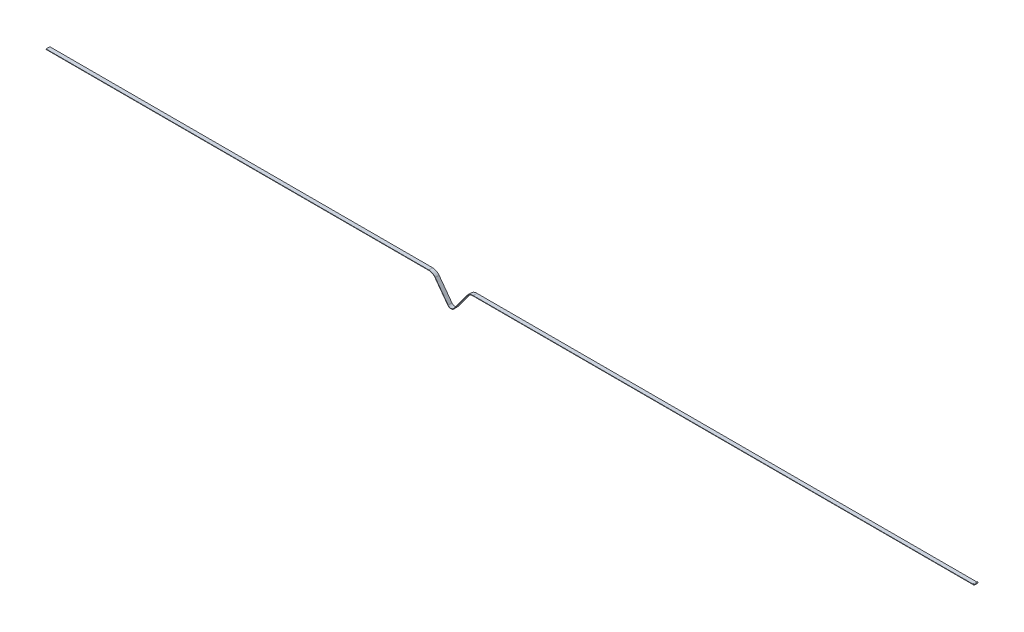
ISO-10303-21;
HEADER;
FILE_DESCRIPTION(('STEP AP214'),'2;1');
FILE_NAME('part.step','',(''),(''),'','','');
FILE_SCHEMA(('AUTOMOTIVE_DESIGN { 1 0 10303 214 1 1 1 1 }'));
ENDSEC;
DATA;
#1=APPLICATION_CONTEXT('core data for automotive mechanical design processes');
#2=APPLICATION_PROTOCOL_DEFINITION('international standard','automotive_design',2000,#1);
#3=PRODUCT_CONTEXT('',#1,'mechanical');
#4=PRODUCT('Part','Part','',(#3));
#5=PRODUCT_RELATED_PRODUCT_CATEGORY('part','',(#4));
#6=PRODUCT_DEFINITION_FORMATION('','',#4);
#7=PRODUCT_DEFINITION_CONTEXT('part definition',#1,'design');
#8=PRODUCT_DEFINITION('design','',#6,#7);
#9=PRODUCT_DEFINITION_SHAPE('','',#8);
#10=(LENGTH_UNIT() NAMED_UNIT(*) SI_UNIT(.MILLI.,.METRE.));
#11=(NAMED_UNIT(*) PLANE_ANGLE_UNIT() SI_UNIT($,.RADIAN.));
#12=(NAMED_UNIT(*) SI_UNIT($,.STERADIAN.) SOLID_ANGLE_UNIT());
#13=UNCERTAINTY_MEASURE_WITH_UNIT(LENGTH_MEASURE(1.E-05),#10,'distance_accuracy_value','');
#14=(GEOMETRIC_REPRESENTATION_CONTEXT(3) GLOBAL_UNCERTAINTY_ASSIGNED_CONTEXT((#13)) GLOBAL_UNIT_ASSIGNED_CONTEXT((#10,
#11,#12)) REPRESENTATION_CONTEXT('',''));
#15=CARTESIAN_POINT('',(0.,0.,0.));
#16=DIRECTION('',(0.,0.,1.));
#17=DIRECTION('',(1.,0.,0.));
#18=AXIS2_PLACEMENT_3D('',#15,#16,#17);
#19=CARTESIAN_POINT('',(0.,0.,0.));
#20=DIRECTION('',(-1.,0.,0.));
#21=DIRECTION('',(0.,0.,1.));
#22=AXIS2_PLACEMENT_3D('',#19,#20,#21);
#23=PLANE('',#22);
#24=DIRECTION('',(0.,-1.,0.));
#25=VECTOR('',#24,1.);
#26=CARTESIAN_POINT('',(0.,0.,0.));
#27=LINE('',#26,#25);
#28=CARTESIAN_POINT('',(0.,0.63,0.));
#29=VERTEX_POINT('',#28);
#30=CARTESIAN_POINT('',(0.,0.,0.));
#31=VERTEX_POINT('',#30);
#32=EDGE_CURVE('E247',#29,#31,#27,.T.);
#33=ORIENTED_EDGE('',*,*,#32,.T.);
#34=DIRECTION('',(0.,0.,-1.));
#35=VECTOR('',#34,1.);
#36=CARTESIAN_POINT('',(0.,0.,0.));
#37=LINE('',#36,#35);
#38=CARTESIAN_POINT('',(0.,0.,-6.));
#39=VERTEX_POINT('',#38);
#40=EDGE_CURVE('E181',#31,#39,#37,.T.);
#41=ORIENTED_EDGE('',*,*,#40,.T.);
#42=DIRECTION('',(0.,1.,0.));
#43=VECTOR('',#42,1.);
#44=CARTESIAN_POINT('',(0.,0.,-6.));
#45=LINE('',#44,#43);
#46=CARTESIAN_POINT('',(0.,0.63,-6.));
#47=VERTEX_POINT('',#46);
#48=EDGE_CURVE('E167',#39,#47,#45,.T.);
#49=ORIENTED_EDGE('',*,*,#48,.T.);
#50=DIRECTION('',(0.,0.,1.));
#51=VECTOR('',#50,1.);
#52=CARTESIAN_POINT('',(0.,0.63,0.));
#53=LINE('',#52,#51);
#54=EDGE_CURVE('E156',#47,#29,#53,.T.);
#55=ORIENTED_EDGE('',*,*,#54,.T.);
#56=EDGE_LOOP('',(#33,#41,#49,#55));
#57=FACE_BOUND('',#56,.T.);
#58=ADVANCED_FACE('F33',(#57),#23,.F.);
#59=CARTESIAN_POINT('',(-1447.8,0.,0.));
#60=DIRECTION('',(-1.,0.,0.));
#61=DIRECTION('',(0.,0.,1.));
#62=AXIS2_PLACEMENT_3D('',#59,#60,#61);
#63=PLANE('',#62);
#64=DIRECTION('',(0.,-1.,0.));
#65=VECTOR('',#64,1.);
#66=CARTESIAN_POINT('',(-1447.8,0.,0.));
#67=LINE('',#66,#65);
#68=CARTESIAN_POINT('',(-1447.8,0.629999999999915,0.));
#69=VERTEX_POINT('',#68);
#70=CARTESIAN_POINT('',(-1447.8,0.,0.));
#71=VERTEX_POINT('',#70);
#72=EDGE_CURVE('E55',#69,#71,#67,.T.);
#73=ORIENTED_EDGE('',*,*,#72,.F.);
#74=DIRECTION('',(0.,0.,1.));
#75=VECTOR('',#74,1.);
#76=CARTESIAN_POINT('',(-1447.8,0.629999999999915,0.));
#77=LINE('',#76,#75);
#78=CARTESIAN_POINT('',(-1447.8,0.629999999999915,-6.));
#79=VERTEX_POINT('',#78);
#80=EDGE_CURVE('E243',#79,#69,#77,.T.);
#81=ORIENTED_EDGE('',*,*,#80,.F.);
#82=DIRECTION('',(0.,1.,0.));
#83=VECTOR('',#82,1.);
#84=CARTESIAN_POINT('',(-1447.8,0.,-6.));
#85=LINE('',#84,#83);
#86=CARTESIAN_POINT('',(-1447.8,0.,-6.));
#87=VERTEX_POINT('',#86);
#88=EDGE_CURVE('E237',#87,#79,#85,.T.);
#89=ORIENTED_EDGE('',*,*,#88,.F.);
#90=DIRECTION('',(0.,0.,-1.));
#91=VECTOR('',#90,1.);
#92=CARTESIAN_POINT('',(-1447.8,0.,0.));
#93=LINE('',#92,#91);
#94=EDGE_CURVE('E11',#71,#87,#93,.T.);
#95=ORIENTED_EDGE('',*,*,#94,.F.);
#96=EDGE_LOOP('',(#73,#81,#89,#95));
#97=FACE_BOUND('',#96,.T.);
#98=ADVANCED_FACE('F367',(#97),#63,.T.);
#99=CARTESIAN_POINT('',(0.,0.,-6.));
#100=DIRECTION('',(0.,0.,1.));
#101=DIRECTION('',(1.,0.,0.));
#102=AXIS2_PLACEMENT_3D('',#99,#100,#101);
#103=PLANE('',#102);
#104=DIRECTION('',(-1.,0.,0.));
#105=VECTOR('',#104,1.);
#106=CARTESIAN_POINT('',(0.,0.63,-6.));
#107=LINE('',#106,#105);
#108=CARTESIAN_POINT('',(-1.5,0.63,-6.));
#109=VERTEX_POINT('',#108);
#110=CARTESIAN_POINT('',(-781.58134885008,0.629999999999905,-6.));
#111=VERTEX_POINT('',#110);
#112=EDGE_CURVE('E164',#109,#111,#107,.T.);
#113=ORIENTED_EDGE('',*,*,#112,.F.);
#114=CARTESIAN_POINT('',(-0.75,0.63,-6.));
#115=DIRECTION('',(0.,0.,1.));
#116=DIRECTION('',(1.,0.,0.));
#117=AXIS2_PLACEMENT_3D('',#114,#115,#116);
#118=CIRCLE('',#117,0.75);
#119=EDGE_CURVE('E150',#47,#109,#118,.T.);
#120=ORIENTED_EDGE('',*,*,#119,.F.);
#121=ORIENTED_EDGE('',*,*,#48,.F.);
#122=DIRECTION('',(-1.,0.,0.));
#123=VECTOR('',#122,1.);
#124=CARTESIAN_POINT('',(0.,0.,-6.));
#125=LINE('',#124,#123);
#126=CARTESIAN_POINT('',(-781.58134885008,0.,-6.));
#127=VERTEX_POINT('',#126);
#128=EDGE_CURVE('E176',#39,#127,#125,.T.);
#129=ORIENTED_EDGE('',*,*,#128,.T.);
#130=DIRECTION('',(0.,1.,0.));
#131=VECTOR('',#130,1.);
#132=CARTESIAN_POINT('',(-781.58134885008,0.,-6.));
#133=LINE('',#132,#131);
#134=EDGE_CURVE('E172',#127,#111,#133,.T.);
#135=ORIENTED_EDGE('',*,*,#134,.T.);
#136=EDGE_LOOP('',(#113,#120,#121,#129,#135));
#137=FACE_BOUND('',#136,.T.);
#138=ADVANCED_FACE('F170',(#137),#103,.F.);
#139=CARTESIAN_POINT('',(0.,0.63,0.));
#140=DIRECTION('',(0.,-1.,0.));
#141=DIRECTION('',(1.,0.,0.));
#142=AXIS2_PLACEMENT_3D('',#139,#140,#141);
#143=PLANE('',#142);
#144=DIRECTION('',(-1.,0.,0.));
#145=VECTOR('',#144,1.);
#146=CARTESIAN_POINT('',(0.,0.63,0.));
#147=LINE('',#146,#145);
#148=CARTESIAN_POINT('',(-1.5,0.63,0.));
#149=VERTEX_POINT('',#148);
#150=CARTESIAN_POINT('',(-781.58134885008,0.629999999999905,0.));
#151=VERTEX_POINT('',#150);
#152=EDGE_CURVE('E166',#149,#151,#147,.T.);
#153=ORIENTED_EDGE('',*,*,#152,.F.);
#154=DIRECTION('',(0.,0.,1.));
#155=VECTOR('',#154,1.);
#156=CARTESIAN_POINT('',(-1.5,0.63,-6.));
#157=LINE('',#156,#155);
#158=EDGE_CURVE('E153',#109,#149,#157,.T.);
#159=ORIENTED_EDGE('',*,*,#158,.F.);
#160=ORIENTED_EDGE('',*,*,#112,.T.);
#161=DIRECTION('',(0.,0.,1.));
#162=VECTOR('',#161,1.);
#163=CARTESIAN_POINT('',(-781.58134885008,0.629999999999905,0.));
#164=LINE('',#163,#162);
#165=EDGE_CURVE('E173',#111,#151,#164,.T.);
#166=ORIENTED_EDGE('',*,*,#165,.T.);
#167=EDGE_LOOP('',(#153,#159,#160,#166));
#168=FACE_BOUND('',#167,.T.);
#169=ADVANCED_FACE('F162',(#168),#143,.F.);
#170=CARTESIAN_POINT('',(0.,0.,0.));
#171=DIRECTION('',(0.,0.,-1.));
#172=DIRECTION('',(-1.,0.,0.));
#173=AXIS2_PLACEMENT_3D('',#170,#171,#172);
#174=PLANE('',#173);
#175=DIRECTION('',(0.,-1.,0.));
#176=VECTOR('',#175,1.);
#177=CARTESIAN_POINT('',(-781.58134885008,0.,0.));
#178=LINE('',#177,#176);
#179=CARTESIAN_POINT('',(-781.58134885008,0.,0.));
#180=VERTEX_POINT('',#179);
#181=EDGE_CURVE('E250',#151,#180,#178,.T.);
#182=ORIENTED_EDGE('',*,*,#181,.T.);
#183=DIRECTION('',(-1.,0.,0.));
#184=VECTOR('',#183,1.);
#185=CARTESIAN_POINT('',(0.,0.,0.));
#186=LINE('',#185,#184);
#187=EDGE_CURVE('E288',#31,#180,#186,.T.);
#188=ORIENTED_EDGE('',*,*,#187,.F.);
#189=ORIENTED_EDGE('',*,*,#32,.F.);
#190=CARTESIAN_POINT('',(-0.75,0.63,0.));
#191=DIRECTION('',(0.,0.,1.));
#192=DIRECTION('',(1.,0.,0.));
#193=AXIS2_PLACEMENT_3D('',#190,#191,#192);
#194=CIRCLE('',#193,0.75);
#195=EDGE_CURVE('E47',#29,#149,#194,.T.);
#196=ORIENTED_EDGE('',*,*,#195,.T.);
#197=ORIENTED_EDGE('',*,*,#152,.T.);
#198=EDGE_LOOP('',(#182,#188,#189,#196,#197));
#199=FACE_BOUND('',#198,.T.);
#200=ADVANCED_FACE('F415',(#199),#174,.F.);
#201=CARTESIAN_POINT('',(0.,0.,0.));
#202=DIRECTION('',(0.,1.,0.));
#203=DIRECTION('',(-1.,0.,0.));
#204=AXIS2_PLACEMENT_3D('',#201,#202,#203);
#205=PLANE('',#204);
#206=DIRECTION('',(0.,0.,-1.));
#207=VECTOR('',#206,1.);
#208=CARTESIAN_POINT('',(-781.58134885008,0.,0.));
#209=LINE('',#208,#207);
#210=EDGE_CURVE('E192',#180,#127,#209,.T.);
#211=ORIENTED_EDGE('',*,*,#210,.T.);
#212=ORIENTED_EDGE('',*,*,#128,.F.);
#213=ORIENTED_EDGE('',*,*,#40,.F.);
#214=ORIENTED_EDGE('',*,*,#187,.T.);
#215=EDGE_LOOP('',(#211,#212,#213,#214));
#216=FACE_BOUND('',#215,.T.);
#217=ADVANCED_FACE('F408',(#216),#205,.F.);
#218=CARTESIAN_POINT('',(-781.58134885008,0.,-6.));
#219=DIRECTION('',(0.,0.,1.));
#220=DIRECTION('',(1.,0.,0.));
#221=AXIS2_PLACEMENT_3D('',#218,#219,#220);
#222=PLANE('',#221);
#223=CARTESIAN_POINT('',(-781.58134885008,-11.9500000001045,-6.));
#224=DIRECTION('',(0.,0.,1.));
#225=DIRECTION('',(0.,1.,0.));
#226=AXIS2_PLACEMENT_3D('',#223,#224,#225);
#227=CIRCLE('',#226,12.5800000001044);
#228=CARTESIAN_POINT('',(-791.721846149833,-4.50508801161619,-6.));
#229=VERTEX_POINT('',#228);
#230=EDGE_CURVE('E185',#111,#229,#227,.T.);
#231=ORIENTED_EDGE('',*,*,#230,.F.);
#232=ORIENTED_EDGE('',*,*,#134,.F.);
#233=CARTESIAN_POINT('',(-781.58134885008,-11.9500000001045,-6.));
#234=DIRECTION('',(0.,0.,1.));
#235=DIRECTION('',(0.,1.,0.));
#236=AXIS2_PLACEMENT_3D('',#233,#234,#235);
#237=CIRCLE('',#236,11.9500000001044);
#238=CARTESIAN_POINT('',(-791.214015203983,-4.87792541644202,-6.));
#239=VERTEX_POINT('',#238);
#240=EDGE_CURVE('E186',#127,#239,#237,.T.);
#241=ORIENTED_EDGE('',*,*,#240,.T.);
#242=DIRECTION('',(-0.806080866428337,0.591805404485412,0.));
#243=VECTOR('',#242,1.);
#244=CARTESIAN_POINT('',(-791.214015203983,-4.87792541644201,-6.));
#245=LINE('',#244,#243);
#246=EDGE_CURVE('E182',#239,#229,#245,.T.);
#247=ORIENTED_EDGE('',*,*,#246,.T.);
#248=EDGE_LOOP('',(#231,#232,#241,#247));
#249=FACE_BOUND('',#248,.T.);
#250=ADVANCED_FACE('F406',(#249),#222,.F.);
#251=CARTESIAN_POINT('',(-781.58134885008,-11.9500000001045,0.));
#252=DIRECTION('',(0.,0.,1.));
#253=DIRECTION('',(1.,0.,0.));
#254=AXIS2_PLACEMENT_3D('',#251,#252,#253);
#255=CYLINDRICAL_SURFACE('',#254,12.5800000001044);
#256=CARTESIAN_POINT('',(-781.58134885008,-11.9500000001045,0.));
#257=DIRECTION('',(0.,0.,1.));
#258=DIRECTION('',(0.,1.,0.));
#259=AXIS2_PLACEMENT_3D('',#256,#257,#258);
#260=CIRCLE('',#259,12.5800000001044);
#261=CARTESIAN_POINT('',(-791.721846149833,-4.50508801161619,0.));
#262=VERTEX_POINT('',#261);
#263=EDGE_CURVE('E253',#151,#262,#260,.T.);
#264=ORIENTED_EDGE('',*,*,#263,.F.);
#265=ORIENTED_EDGE('',*,*,#165,.F.);
#266=ORIENTED_EDGE('',*,*,#230,.T.);
#267=DIRECTION('',(0.,0.,1.));
#268=VECTOR('',#267,1.);
#269=CARTESIAN_POINT('',(-791.721846149833,-4.5050880116162,0.));
#270=LINE('',#269,#268);
#271=EDGE_CURVE('E189',#229,#262,#270,.T.);
#272=ORIENTED_EDGE('',*,*,#271,.T.);
#273=EDGE_LOOP('',(#264,#265,#266,#272));
#274=FACE_BOUND('',#273,.T.);
#275=ADVANCED_FACE('F404',(#274),#255,.T.);
#276=CARTESIAN_POINT('',(-781.58134885008,0.,0.));
#277=DIRECTION('',(0.,0.,-1.));
#278=DIRECTION('',(-1.,0.,0.));
#279=AXIS2_PLACEMENT_3D('',#276,#277,#278);
#280=PLANE('',#279);
#281=CARTESIAN_POINT('',(-781.58134885008,-11.9500000001045,0.));
#282=DIRECTION('',(0.,0.,1.));
#283=DIRECTION('',(0.,1.,0.));
#284=AXIS2_PLACEMENT_3D('',#281,#282,#283);
#285=CIRCLE('',#284,11.9500000001044);
#286=CARTESIAN_POINT('',(-791.214015203983,-4.87792541644202,0.));
#287=VERTEX_POINT('',#286);
#288=EDGE_CURVE('E292',#180,#287,#285,.T.);
#289=ORIENTED_EDGE('',*,*,#288,.F.);
#290=ORIENTED_EDGE('',*,*,#181,.F.);
#291=ORIENTED_EDGE('',*,*,#263,.T.);
#292=DIRECTION('',(0.806080866428337,-0.591805404485412,0.));
#293=VECTOR('',#292,1.);
#294=CARTESIAN_POINT('',(-791.214015203983,-4.87792541644201,0.));
#295=LINE('',#294,#293);
#296=EDGE_CURVE('E256',#262,#287,#295,.T.);
#297=ORIENTED_EDGE('',*,*,#296,.T.);
#298=EDGE_LOOP('',(#289,#290,#291,#297));
#299=FACE_BOUND('',#298,.T.);
#300=ADVANCED_FACE('F395',(#299),#280,.F.);
#301=CARTESIAN_POINT('',(-781.58134885008,-11.9500000001045,0.));
#302=DIRECTION('',(0.,0.,1.));
#303=DIRECTION('',(1.,0.,0.));
#304=AXIS2_PLACEMENT_3D('',#301,#302,#303);
#305=CYLINDRICAL_SURFACE('',#304,11.9500000001044);
#306=DIRECTION('',(0.,0.,-1.));
#307=VECTOR('',#306,1.);
#308=CARTESIAN_POINT('',(-791.214015203983,-4.87792541644201,0.));
#309=LINE('',#308,#307);
#310=EDGE_CURVE('E203',#287,#239,#309,.T.);
#311=ORIENTED_EDGE('',*,*,#310,.T.);
#312=ORIENTED_EDGE('',*,*,#240,.F.);
#313=ORIENTED_EDGE('',*,*,#210,.F.);
#314=ORIENTED_EDGE('',*,*,#288,.T.);
#315=EDGE_LOOP('',(#311,#312,#313,#314));
#316=FACE_BOUND('',#315,.T.);
#317=ADVANCED_FACE('F389',(#316),#305,.F.);
#318=CARTESIAN_POINT('',(-791.214015203983,-4.87792541644199,-6.));
#319=DIRECTION('',(0.,0.,1.));
#320=DIRECTION('',(1.,0.,0.));
#321=AXIS2_PLACEMENT_3D('',#318,#319,#320);
#322=PLANE('',#321);
#323=DIRECTION('',(-0.591805404485413,-0.806080866428336,0.));
#324=VECTOR('',#323,1.);
#325=CARTESIAN_POINT('',(-791.721846149833,-4.50508801161618,-6.));
#326=LINE('',#325,#324);
#327=CARTESIAN_POINT('',(-811.734025702053,-31.7630936166842,-6.));
#328=VERTEX_POINT('',#327);
#329=EDGE_CURVE('E196',#229,#328,#326,.T.);
#330=ORIENTED_EDGE('',*,*,#329,.F.);
#331=ORIENTED_EDGE('',*,*,#246,.F.);
#332=DIRECTION('',(-0.591805404485413,-0.806080866428336,0.));
#333=VECTOR('',#332,1.);
#334=CARTESIAN_POINT('',(-791.214015203983,-4.87792541644199,-6.));
#335=LINE('',#334,#333);
#336=CARTESIAN_POINT('',(-811.226194756203,-32.13593102151,-6.));
#337=VERTEX_POINT('',#336);
#338=EDGE_CURVE('E197',#239,#337,#335,.T.);
#339=ORIENTED_EDGE('',*,*,#338,.T.);
#340=DIRECTION('',(-0.806080866428336,0.591805404485413,0.));
#341=VECTOR('',#340,1.);
#342=CARTESIAN_POINT('',(-811.226194756203,-32.13593102151,-6.));
#343=LINE('',#342,#341);
#344=EDGE_CURVE('E193',#337,#328,#343,.T.);
#345=ORIENTED_EDGE('',*,*,#344,.T.);
#346=EDGE_LOOP('',(#330,#331,#339,#345));
#347=FACE_BOUND('',#346,.T.);
#348=ADVANCED_FACE('F383',(#347),#322,.F.);
#349=CARTESIAN_POINT('',(-791.721846149833,-4.50508801161618,0.));
#350=DIRECTION('',(0.806080866428336,-0.591805404485413,0.));
#351=DIRECTION('',(0.591805404485413,0.806080866428336,0.));
#352=AXIS2_PLACEMENT_3D('',#349,#350,#351);
#353=PLANE('',#352);
#354=DIRECTION('',(-0.591805404485413,-0.806080866428336,0.));
#355=VECTOR('',#354,1.);
#356=CARTESIAN_POINT('',(-791.721846149833,-4.50508801161618,0.));
#357=LINE('',#356,#355);
#358=CARTESIAN_POINT('',(-811.734025702053,-31.7630936166842,0.));
#359=VERTEX_POINT('',#358);
#360=EDGE_CURVE('E259',#262,#359,#357,.T.);
#361=ORIENTED_EDGE('',*,*,#360,.F.);
#362=ORIENTED_EDGE('',*,*,#271,.F.);
#363=ORIENTED_EDGE('',*,*,#329,.T.);
#364=DIRECTION('',(0.,0.,1.));
#365=VECTOR('',#364,1.);
#366=CARTESIAN_POINT('',(-811.734025702053,-31.7630936166842,0.));
#367=LINE('',#366,#365);
#368=EDGE_CURVE('E200',#328,#359,#367,.T.);
#369=ORIENTED_EDGE('',*,*,#368,.T.);
#370=EDGE_LOOP('',(#361,#362,#363,#369));
#371=FACE_BOUND('',#370,.T.);
#372=ADVANCED_FACE('F401',(#371),#353,.F.);
#373=CARTESIAN_POINT('',(-791.214015203983,-4.87792541644199,0.));
#374=DIRECTION('',(0.,0.,-1.));
#375=DIRECTION('',(-1.,0.,0.));
#376=AXIS2_PLACEMENT_3D('',#373,#374,#375);
#377=PLANE('',#376);
#378=DIRECTION('',(-0.591805404485413,-0.806080866428336,0.));
#379=VECTOR('',#378,1.);
#380=CARTESIAN_POINT('',(-791.214015203983,-4.87792541644199,0.));
#381=LINE('',#380,#379);
#382=CARTESIAN_POINT('',(-811.226194756203,-32.13593102151,0.));
#383=VERTEX_POINT('',#382);
#384=EDGE_CURVE('E297',#287,#383,#381,.T.);
#385=ORIENTED_EDGE('',*,*,#384,.F.);
#386=ORIENTED_EDGE('',*,*,#296,.F.);
#387=ORIENTED_EDGE('',*,*,#360,.T.);
#388=DIRECTION('',(0.806080866428336,-0.591805404485413,0.));
#389=VECTOR('',#388,1.);
#390=CARTESIAN_POINT('',(-811.226194756203,-32.13593102151,0.));
#391=LINE('',#390,#389);
#392=EDGE_CURVE('E262',#359,#383,#391,.T.);
#393=ORIENTED_EDGE('',*,*,#392,.T.);
#394=EDGE_LOOP('',(#385,#386,#387,#393));
#395=FACE_BOUND('',#394,.T.);
#396=ADVANCED_FACE('F398',(#395),#377,.F.);
#397=CARTESIAN_POINT('',(-791.214015203983,-4.87792541644199,0.));
#398=DIRECTION('',(-0.806080866428336,0.591805404485413,0.));
#399=DIRECTION('',(-0.591805404485413,-0.806080866428336,0.));
#400=AXIS2_PLACEMENT_3D('',#397,#398,#399);
#401=PLANE('',#400);
#402=DIRECTION('',(0.,0.,-1.));
#403=VECTOR('',#402,1.);
#404=CARTESIAN_POINT('',(-811.226194756203,-32.13593102151,0.));
#405=LINE('',#404,#403);
#406=EDGE_CURVE('E214',#383,#337,#405,.T.);
#407=ORIENTED_EDGE('',*,*,#406,.T.);
#408=ORIENTED_EDGE('',*,*,#338,.F.);
#409=ORIENTED_EDGE('',*,*,#310,.F.);
#410=ORIENTED_EDGE('',*,*,#384,.T.);
#411=EDGE_LOOP('',(#407,#408,#409,#410));
#412=FACE_BOUND('',#411,.T.);
#413=ADVANCED_FACE('F386',(#412),#401,.F.);
#414=CARTESIAN_POINT('',(-811.226194756203,-32.1359310215099,-6.));
#415=DIRECTION('',(0.,0.,1.));
#416=DIRECTION('',(1.,0.,0.));
#417=AXIS2_PLACEMENT_3D('',#414,#415,#416);
#418=PLANE('',#417);
#419=CARTESIAN_POINT('',(-816.15134885008,-28.5200000001041,-6.));
#420=DIRECTION('',(0.,0.,-1.));
#421=DIRECTION('',(0.806080866428331,-0.591805404485419,0.));
#422=AXIS2_PLACEMENT_3D('',#419,#420,#421);
#423=CIRCLE('',#422,5.47999999999997);
#424=CARTESIAN_POINT('',(-820.568671998107,-31.7630936166841,-6.));
#425=VERTEX_POINT('',#424);
#426=EDGE_CURVE('E207',#328,#425,#423,.T.);
#427=ORIENTED_EDGE('',*,*,#426,.F.);
#428=ORIENTED_EDGE('',*,*,#344,.F.);
#429=CARTESIAN_POINT('',(-816.15134885008,-28.5200000001041,-6.));
#430=DIRECTION('',(0.,0.,-1.));
#431=DIRECTION('',(0.80608086642833,-0.59180540448542,0.));
#432=AXIS2_PLACEMENT_3D('',#429,#430,#431);
#433=CIRCLE('',#432,6.10999999999995);
#434=CARTESIAN_POINT('',(-821.076502943957,-32.13593102151,-6.));
#435=VERTEX_POINT('',#434);
#436=EDGE_CURVE('E208',#337,#435,#433,.T.);
#437=ORIENTED_EDGE('',*,*,#436,.T.);
#438=DIRECTION('',(0.806080866428327,0.591805404485426,0.));
#439=VECTOR('',#438,1.);
#440=CARTESIAN_POINT('',(-821.076502943957,-32.13593102151,-6.));
#441=LINE('',#440,#439);
#442=EDGE_CURVE('E204',#435,#425,#441,.T.);
#443=ORIENTED_EDGE('',*,*,#442,.T.);
#444=EDGE_LOOP('',(#427,#428,#437,#443));
#445=FACE_BOUND('',#444,.T.);
#446=ADVANCED_FACE('F380',(#445),#418,.F.);
#447=CARTESIAN_POINT('',(-816.15134885008,-28.5200000001041,0.));
#448=DIRECTION('',(0.,0.,-1.));
#449=DIRECTION('',(-1.,0.,0.));
#450=AXIS2_PLACEMENT_3D('',#447,#448,#449);
#451=CYLINDRICAL_SURFACE('',#450,5.47999999999997);
#452=CARTESIAN_POINT('',(-816.15134885008,-28.5200000001041,0.));
#453=DIRECTION('',(0.,0.,-1.));
#454=DIRECTION('',(0.806080866428331,-0.591805404485419,0.));
#455=AXIS2_PLACEMENT_3D('',#452,#453,#454);
#456=CIRCLE('',#455,5.47999999999997);
#457=CARTESIAN_POINT('',(-820.568671998107,-31.7630936166841,0.));
#458=VERTEX_POINT('',#457);
#459=EDGE_CURVE('E265',#359,#458,#456,.T.);
#460=ORIENTED_EDGE('',*,*,#459,.F.);
#461=ORIENTED_EDGE('',*,*,#368,.F.);
#462=ORIENTED_EDGE('',*,*,#426,.T.);
#463=DIRECTION('',(0.,0.,1.));
#464=VECTOR('',#463,1.);
#465=CARTESIAN_POINT('',(-820.568671998107,-31.7630936166842,0.));
#466=LINE('',#465,#464);
#467=EDGE_CURVE('E211',#425,#458,#466,.T.);
#468=ORIENTED_EDGE('',*,*,#467,.T.);
#469=EDGE_LOOP('',(#460,#461,#462,#468));
#470=FACE_BOUND('',#469,.T.);
#471=ADVANCED_FACE('F377',(#470),#451,.F.);
#472=CARTESIAN_POINT('',(-811.226194756203,-32.1359310215099,0.));
#473=DIRECTION('',(0.,0.,-1.));
#474=DIRECTION('',(-1.,0.,0.));
#475=AXIS2_PLACEMENT_3D('',#472,#473,#474);
#476=PLANE('',#475);
#477=CARTESIAN_POINT('',(-816.15134885008,-28.5200000001041,0.));
#478=DIRECTION('',(0.,0.,-1.));
#479=DIRECTION('',(0.80608086642833,-0.59180540448542,0.));
#480=AXIS2_PLACEMENT_3D('',#477,#478,#479);
#481=CIRCLE('',#480,6.10999999999995);
#482=CARTESIAN_POINT('',(-821.076502943957,-32.13593102151,0.));
#483=VERTEX_POINT('',#482);
#484=EDGE_CURVE('E302',#383,#483,#481,.T.);
#485=ORIENTED_EDGE('',*,*,#484,.F.);
#486=ORIENTED_EDGE('',*,*,#392,.F.);
#487=ORIENTED_EDGE('',*,*,#459,.T.);
#488=DIRECTION('',(-0.806080866428327,-0.591805404485426,0.));
#489=VECTOR('',#488,1.);
#490=CARTESIAN_POINT('',(-821.076502943957,-32.13593102151,0.));
#491=LINE('',#490,#489);
#492=EDGE_CURVE('E268',#458,#483,#491,.T.);
#493=ORIENTED_EDGE('',*,*,#492,.T.);
#494=EDGE_LOOP('',(#485,#486,#487,#493));
#495=FACE_BOUND('',#494,.T.);
#496=ADVANCED_FACE('F355',(#495),#476,.F.);
#497=CARTESIAN_POINT('',(-816.15134885008,-28.5200000001041,0.));
#498=DIRECTION('',(0.,0.,-1.));
#499=DIRECTION('',(-1.,0.,0.));
#500=AXIS2_PLACEMENT_3D('',#497,#498,#499);
#501=CYLINDRICAL_SURFACE('',#500,6.10999999999995);
#502=DIRECTION('',(0.,0.,-1.));
#503=VECTOR('',#502,1.);
#504=CARTESIAN_POINT('',(-821.076502943957,-32.13593102151,0.));
#505=LINE('',#504,#503);
#506=EDGE_CURVE('E225',#483,#435,#505,.T.);
#507=ORIENTED_EDGE('',*,*,#506,.T.);
#508=ORIENTED_EDGE('',*,*,#436,.F.);
#509=ORIENTED_EDGE('',*,*,#406,.F.);
#510=ORIENTED_EDGE('',*,*,#484,.T.);
#511=EDGE_LOOP('',(#507,#508,#509,#510));
#512=FACE_BOUND('',#511,.T.);
#513=ADVANCED_FACE('F350',(#512),#501,.T.);
#514=CARTESIAN_POINT('',(-821.076502943957,-32.1359310215099,-6.));
#515=DIRECTION('',(0.,0.,1.));
#516=DIRECTION('',(1.,0.,0.));
#517=AXIS2_PLACEMENT_3D('',#514,#515,#516);
#518=PLANE('',#517);
#519=DIRECTION('',(-0.591805404485416,0.806080866428334,0.));
#520=VECTOR('',#519,1.);
#521=CARTESIAN_POINT('',(-820.568671998107,-31.7630936166841,-6.));
#522=LINE('',#521,#520);
#523=CARTESIAN_POINT('',(-840.580851550327,-4.50508801161627,-6.));
#524=VERTEX_POINT('',#523);
#525=EDGE_CURVE('E218',#425,#524,#522,.T.);
#526=ORIENTED_EDGE('',*,*,#525,.F.);
#527=ORIENTED_EDGE('',*,*,#442,.F.);
#528=DIRECTION('',(-0.591805404485416,0.806080866428334,0.));
#529=VECTOR('',#528,1.);
#530=CARTESIAN_POINT('',(-821.076502943957,-32.1359310215099,-6.));
#531=LINE('',#530,#529);
#532=CARTESIAN_POINT('',(-841.088682496177,-4.87792541644208,-6.));
#533=VERTEX_POINT('',#532);
#534=EDGE_CURVE('E219',#435,#533,#531,.T.);
#535=ORIENTED_EDGE('',*,*,#534,.T.);
#536=DIRECTION('',(0.806080866428334,0.591805404485416,0.));
#537=VECTOR('',#536,1.);
#538=CARTESIAN_POINT('',(-841.088682496177,-4.87792541644207,-6.));
#539=LINE('',#538,#537);
#540=EDGE_CURVE('E215',#533,#524,#539,.T.);
#541=ORIENTED_EDGE('',*,*,#540,.T.);
#542=EDGE_LOOP('',(#526,#527,#535,#541));
#543=FACE_BOUND('',#542,.T.);
#544=ADVANCED_FACE('F345',(#543),#518,.F.);
#545=CARTESIAN_POINT('',(-820.568671998107,-31.7630936166841,0.));
#546=DIRECTION('',(-0.806080866428334,-0.591805404485416,0.));
#547=DIRECTION('',(0.591805404485416,-0.806080866428334,0.));
#548=AXIS2_PLACEMENT_3D('',#545,#546,#547);
#549=PLANE('',#548);
#550=DIRECTION('',(-0.591805404485416,0.806080866428334,0.));
#551=VECTOR('',#550,1.);
#552=CARTESIAN_POINT('',(-820.568671998107,-31.7630936166841,0.));
#553=LINE('',#552,#551);
#554=CARTESIAN_POINT('',(-840.580851550327,-4.50508801161627,0.));
#555=VERTEX_POINT('',#554);
#556=EDGE_CURVE('E271',#458,#555,#553,.T.);
#557=ORIENTED_EDGE('',*,*,#556,.F.);
#558=ORIENTED_EDGE('',*,*,#467,.F.);
#559=ORIENTED_EDGE('',*,*,#525,.T.);
#560=DIRECTION('',(0.,0.,1.));
#561=VECTOR('',#560,1.);
#562=CARTESIAN_POINT('',(-840.580851550327,-4.50508801161626,0.));
#563=LINE('',#562,#561);
#564=EDGE_CURVE('E222',#524,#555,#563,.T.);
#565=ORIENTED_EDGE('',*,*,#564,.T.);
#566=EDGE_LOOP('',(#557,#558,#559,#565));
#567=FACE_BOUND('',#566,.T.);
#568=ADVANCED_FACE('F374',(#567),#549,.F.);
#569=CARTESIAN_POINT('',(-821.076502943957,-32.1359310215099,0.));
#570=DIRECTION('',(0.,0.,-1.));
#571=DIRECTION('',(-1.,0.,0.));
#572=AXIS2_PLACEMENT_3D('',#569,#570,#571);
#573=PLANE('',#572);
#574=DIRECTION('',(-0.591805404485416,0.806080866428334,0.));
#575=VECTOR('',#574,1.);
#576=CARTESIAN_POINT('',(-821.076502943957,-32.1359310215099,0.));
#577=LINE('',#576,#575);
#578=CARTESIAN_POINT('',(-841.088682496177,-4.87792541644208,0.));
#579=VERTEX_POINT('',#578);
#580=EDGE_CURVE('E307',#483,#579,#577,.T.);
#581=ORIENTED_EDGE('',*,*,#580,.F.);
#582=ORIENTED_EDGE('',*,*,#492,.F.);
#583=ORIENTED_EDGE('',*,*,#556,.T.);
#584=DIRECTION('',(-0.806080866428334,-0.591805404485416,0.));
#585=VECTOR('',#584,1.);
#586=CARTESIAN_POINT('',(-841.088682496177,-4.87792541644207,0.));
#587=LINE('',#586,#585);
#588=EDGE_CURVE('E274',#555,#579,#587,.T.);
#589=ORIENTED_EDGE('',*,*,#588,.T.);
#590=EDGE_LOOP('',(#581,#582,#583,#589));
#591=FACE_BOUND('',#590,.T.);
#592=ADVANCED_FACE('F357',(#591),#573,.F.);
#593=CARTESIAN_POINT('',(-821.076502943957,-32.1359310215099,0.));
#594=DIRECTION('',(0.806080866428334,0.591805404485416,0.));
#595=DIRECTION('',(-0.591805404485416,0.806080866428334,0.));
#596=AXIS2_PLACEMENT_3D('',#593,#594,#595);
#597=PLANE('',#596);
#598=DIRECTION('',(0.,0.,-1.));
#599=VECTOR('',#598,1.);
#600=CARTESIAN_POINT('',(-841.088682496177,-4.87792541644207,0.));
#601=LINE('',#600,#599);
#602=EDGE_CURVE('E236',#579,#533,#601,.T.);
#603=ORIENTED_EDGE('',*,*,#602,.T.);
#604=ORIENTED_EDGE('',*,*,#534,.F.);
#605=ORIENTED_EDGE('',*,*,#506,.F.);
#606=ORIENTED_EDGE('',*,*,#580,.T.);
#607=EDGE_LOOP('',(#603,#604,#605,#606));
#608=FACE_BOUND('',#607,.T.);
#609=ADVANCED_FACE('F348',(#608),#597,.F.);
#610=CARTESIAN_POINT('',(-841.088682496177,-4.87792541644208,-6.));
#611=DIRECTION('',(0.,0.,1.));
#612=DIRECTION('',(1.,0.,0.));
#613=AXIS2_PLACEMENT_3D('',#610,#611,#612);
#614=PLANE('',#613);
#615=CARTESIAN_POINT('',(-850.72134885008,-11.9500000001047,-6.));
#616=DIRECTION('',(0.,0.,1.));
#617=DIRECTION('',(0.806080866428333,0.591805404485417,0.));
#618=AXIS2_PLACEMENT_3D('',#615,#616,#617);
#619=CIRCLE('',#618,12.5800000001046);
#620=CARTESIAN_POINT('',(-850.72134885008,0.629999999999889,-6.));
#621=VERTEX_POINT('',#620);
#622=EDGE_CURVE('E229',#524,#621,#619,.T.);
#623=ORIENTED_EDGE('',*,*,#622,.F.);
#624=ORIENTED_EDGE('',*,*,#540,.F.);
#625=CARTESIAN_POINT('',(-850.72134885008,-11.9500000001047,-6.));
#626=DIRECTION('',(0.,0.,1.));
#627=DIRECTION('',(0.806080866428334,0.591805404485416,0.));
#628=AXIS2_PLACEMENT_3D('',#625,#626,#627);
#629=CIRCLE('',#628,11.9500000001046);
#630=CARTESIAN_POINT('',(-850.72134885008,0.,-6.));
#631=VERTEX_POINT('',#630);
#632=EDGE_CURVE('E230',#533,#631,#629,.T.);
#633=ORIENTED_EDGE('',*,*,#632,.T.);
#634=DIRECTION('',(0.,1.,0.));
#635=VECTOR('',#634,1.);
#636=CARTESIAN_POINT('',(-850.72134885008,0.,-6.));
#637=LINE('',#636,#635);
#638=EDGE_CURVE('E226',#631,#621,#637,.T.);
#639=ORIENTED_EDGE('',*,*,#638,.T.);
#640=EDGE_LOOP('',(#623,#624,#633,#639));
#641=FACE_BOUND('',#640,.T.);
#642=ADVANCED_FACE('F341',(#641),#614,.F.);
#643=CARTESIAN_POINT('',(-850.72134885008,-11.9500000001047,0.));
#644=DIRECTION('',(0.,0.,1.));
#645=DIRECTION('',(1.,0.,0.));
#646=AXIS2_PLACEMENT_3D('',#643,#644,#645);
#647=CYLINDRICAL_SURFACE('',#646,12.5800000001046);
#648=CARTESIAN_POINT('',(-850.72134885008,-11.9500000001047,0.));
#649=DIRECTION('',(0.,0.,1.));
#650=DIRECTION('',(0.806080866428333,0.591805404485417,0.));
#651=AXIS2_PLACEMENT_3D('',#648,#649,#650);
#652=CIRCLE('',#651,12.5800000001046);
#653=CARTESIAN_POINT('',(-850.72134885008,0.629999999999889,0.));
#654=VERTEX_POINT('',#653);
#655=EDGE_CURVE('E277',#555,#654,#652,.T.);
#656=ORIENTED_EDGE('',*,*,#655,.F.);
#657=ORIENTED_EDGE('',*,*,#564,.F.);
#658=ORIENTED_EDGE('',*,*,#622,.T.);
#659=DIRECTION('',(0.,0.,1.));
#660=VECTOR('',#659,1.);
#661=CARTESIAN_POINT('',(-850.72134885008,0.629999999999903,0.));
#662=LINE('',#661,#660);
#663=EDGE_CURVE('E233',#621,#654,#662,.T.);
#664=ORIENTED_EDGE('',*,*,#663,.T.);
#665=EDGE_LOOP('',(#656,#657,#658,#664));
#666=FACE_BOUND('',#665,.T.);
#667=ADVANCED_FACE('F371',(#666),#647,.T.);
#668=CARTESIAN_POINT('',(-841.088682496177,-4.87792541644208,0.));
#669=DIRECTION('',(0.,0.,-1.));
#670=DIRECTION('',(-1.,0.,0.));
#671=AXIS2_PLACEMENT_3D('',#668,#669,#670);
#672=PLANE('',#671);
#673=CARTESIAN_POINT('',(-850.72134885008,-11.9500000001047,0.));
#674=DIRECTION('',(0.,0.,1.));
#675=DIRECTION('',(0.806080866428334,0.591805404485416,0.));
#676=AXIS2_PLACEMENT_3D('',#673,#674,#675);
#677=CIRCLE('',#676,11.9500000001046);
#678=CARTESIAN_POINT('',(-850.72134885008,0.,0.));
#679=VERTEX_POINT('',#678);
#680=EDGE_CURVE('E312',#579,#679,#677,.T.);
#681=ORIENTED_EDGE('',*,*,#680,.F.);
#682=ORIENTED_EDGE('',*,*,#588,.F.);
#683=ORIENTED_EDGE('',*,*,#655,.T.);
#684=DIRECTION('',(0.,-1.,0.));
#685=VECTOR('',#684,1.);
#686=CARTESIAN_POINT('',(-850.72134885008,0.,0.));
#687=LINE('',#686,#685);
#688=EDGE_CURVE('E280',#654,#679,#687,.T.);
#689=ORIENTED_EDGE('',*,*,#688,.T.);
#690=EDGE_LOOP('',(#681,#682,#683,#689));
#691=FACE_BOUND('',#690,.T.);
#692=ADVANCED_FACE('F360',(#691),#672,.F.);
#693=CARTESIAN_POINT('',(-850.72134885008,-11.9500000001047,0.));
#694=DIRECTION('',(0.,0.,1.));
#695=DIRECTION('',(1.,0.,0.));
#696=AXIS2_PLACEMENT_3D('',#693,#694,#695);
#697=CYLINDRICAL_SURFACE('',#696,11.9500000001046);
#698=DIRECTION('',(0.,0.,-1.));
#699=VECTOR('',#698,1.);
#700=CARTESIAN_POINT('',(-850.72134885008,0.,0.));
#701=LINE('',#700,#699);
#702=EDGE_CURVE('E246',#679,#631,#701,.T.);
#703=ORIENTED_EDGE('',*,*,#702,.T.);
#704=ORIENTED_EDGE('',*,*,#632,.F.);
#705=ORIENTED_EDGE('',*,*,#602,.F.);
#706=ORIENTED_EDGE('',*,*,#680,.T.);
#707=EDGE_LOOP('',(#703,#704,#705,#706));
#708=FACE_BOUND('',#707,.T.);
#709=ADVANCED_FACE('F333',(#708),#697,.F.);
#710=CARTESIAN_POINT('',(-850.72134885008,-1.04083408558608E-13,-6.));
#711=DIRECTION('',(0.,0.,1.));
#712=DIRECTION('',(1.,0.,0.));
#713=AXIS2_PLACEMENT_3D('',#710,#711,#712);
#714=PLANE('',#713);
#715=DIRECTION('',(-1.,0.,0.));
#716=VECTOR('',#715,1.);
#717=CARTESIAN_POINT('',(-850.72134885008,0.629999999999896,-6.));
#718=LINE('',#717,#716);
#719=EDGE_CURVE('E239',#621,#79,#718,.T.);
#720=ORIENTED_EDGE('',*,*,#719,.F.);
#721=ORIENTED_EDGE('',*,*,#638,.F.);
#722=DIRECTION('',(-1.,0.,0.));
#723=VECTOR('',#722,1.);
#724=CARTESIAN_POINT('',(-850.72134885008,-1.04083408558608E-13,-6.));
#725=LINE('',#724,#723);
#726=EDGE_CURVE('E240',#631,#87,#725,.T.);
#727=ORIENTED_EDGE('',*,*,#726,.T.);
#728=ORIENTED_EDGE('',*,*,#88,.T.);
#729=EDGE_LOOP('',(#720,#721,#727,#728));
#730=FACE_BOUND('',#729,.T.);
#731=ADVANCED_FACE('F337',(#730),#714,.F.);
#732=CARTESIAN_POINT('',(-850.72134885008,0.629999999999896,0.));
#733=DIRECTION('',(0.,-1.,0.));
#734=DIRECTION('',(1.,0.,0.));
#735=AXIS2_PLACEMENT_3D('',#732,#733,#734);
#736=PLANE('',#735);
#737=DIRECTION('',(-1.,0.,0.));
#738=VECTOR('',#737,1.);
#739=CARTESIAN_POINT('',(-850.72134885008,0.629999999999896,0.));
#740=LINE('',#739,#738);
#741=EDGE_CURVE('E282',#654,#69,#740,.T.);
#742=ORIENTED_EDGE('',*,*,#741,.F.);
#743=ORIENTED_EDGE('',*,*,#663,.F.);
#744=ORIENTED_EDGE('',*,*,#719,.T.);
#745=ORIENTED_EDGE('',*,*,#80,.T.);
#746=EDGE_LOOP('',(#742,#743,#744,#745));
#747=FACE_BOUND('',#746,.T.);
#748=ADVANCED_FACE('F369',(#747),#736,.F.);
#749=CARTESIAN_POINT('',(-850.72134885008,-1.04083408558608E-13,0.));
#750=DIRECTION('',(0.,0.,-1.));
#751=DIRECTION('',(-1.,0.,0.));
#752=AXIS2_PLACEMENT_3D('',#749,#750,#751);
#753=PLANE('',#752);
#754=DIRECTION('',(-1.,0.,0.));
#755=VECTOR('',#754,1.);
#756=CARTESIAN_POINT('',(-850.72134885008,-1.04083408558608E-13,0.));
#757=LINE('',#756,#755);
#758=EDGE_CURVE('E40',#679,#71,#757,.T.);
#759=ORIENTED_EDGE('',*,*,#758,.F.);
#760=ORIENTED_EDGE('',*,*,#688,.F.);
#761=ORIENTED_EDGE('',*,*,#741,.T.);
#762=ORIENTED_EDGE('',*,*,#72,.T.);
#763=EDGE_LOOP('',(#759,#760,#761,#762));
#764=FACE_BOUND('',#763,.T.);
#765=ADVANCED_FACE('F362',(#764),#753,.F.);
#766=CARTESIAN_POINT('',(-850.72134885008,-1.04083408558608E-13,0.));
#767=DIRECTION('',(0.,1.,0.));
#768=DIRECTION('',(-1.,0.,0.));
#769=AXIS2_PLACEMENT_3D('',#766,#767,#768);
#770=PLANE('',#769);
#771=ORIENTED_EDGE('',*,*,#94,.T.);
#772=ORIENTED_EDGE('',*,*,#726,.F.);
#773=ORIENTED_EDGE('',*,*,#702,.F.);
#774=ORIENTED_EDGE('',*,*,#758,.T.);
#775=EDGE_LOOP('',(#771,#772,#773,#774));
#776=FACE_BOUND('',#775,.T.);
#777=ADVANCED_FACE('F363',(#776),#770,.F.);
#778=CARTESIAN_POINT('',(-0.75,0.63,-6.));
#779=DIRECTION('',(0.,0.,1.));
#780=DIRECTION('',(1.,0.,0.));
#781=AXIS2_PLACEMENT_3D('',#778,#779,#780);
#782=CYLINDRICAL_SURFACE('',#781,0.75);
#783=ORIENTED_EDGE('',*,*,#195,.F.);
#784=ORIENTED_EDGE('',*,*,#54,.F.);
#785=ORIENTED_EDGE('',*,*,#119,.T.);
#786=ORIENTED_EDGE('',*,*,#158,.T.);
#787=EDGE_LOOP('',(#783,#784,#785,#786));
#788=FACE_BOUND('',#787,.T.);
#789=ADVANCED_FACE('F152',(#788),#782,.T.);
#790=CLOSED_SHELL('',(#58,#98,#138,#169,#200,#217,#250,#275,#300,#317,#348,#372,#396,#413,#446,
#471,#496,#513,#544,#568,#592,#609,#642,#667,#692,#709,#731,#748,#765,#777,#789));
#791=MANIFOLD_SOLID_BREP('B2',#790);
#792=ADVANCED_BREP_SHAPE_REPRESENTATION('',(#18,#791),#14);
#793=SHAPE_DEFINITION_REPRESENTATION(#9,#792);
ENDSEC;
END-ISO-10303-21;
